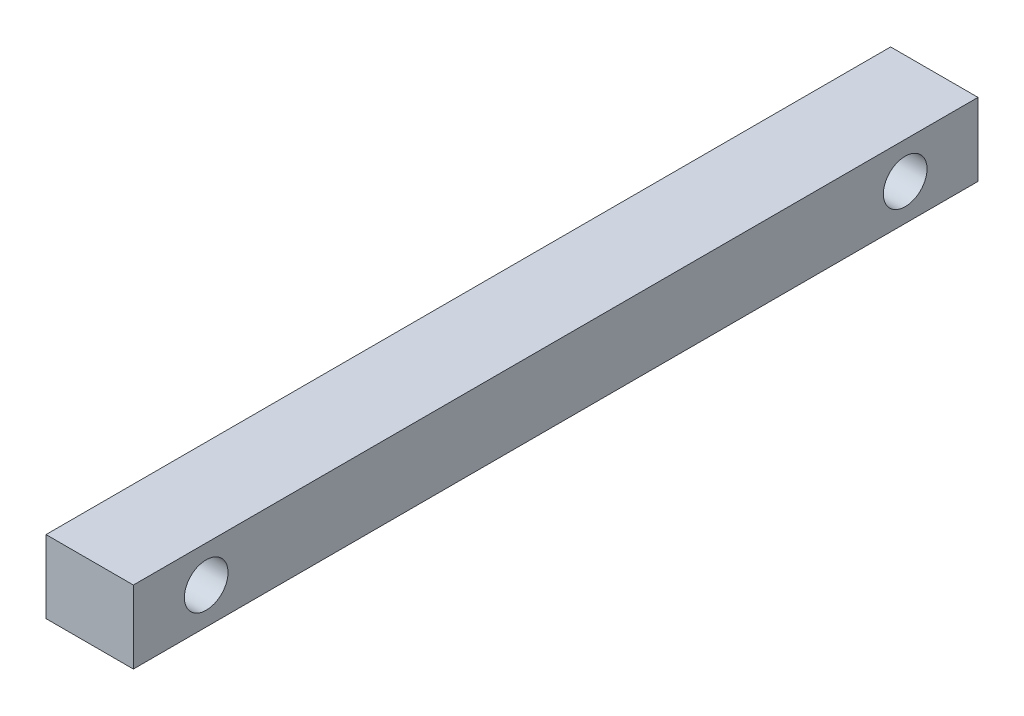
ISO-10303-21;
HEADER;
FILE_DESCRIPTION(('STEP AP214'),'2;1');
FILE_NAME('part.step','',(''),(''),'','','');
FILE_SCHEMA(('AUTOMOTIVE_DESIGN { 1 0 10303 214 1 1 1 1 }'));
ENDSEC;
DATA;
#1=APPLICATION_CONTEXT('core data for automotive mechanical design processes');
#2=APPLICATION_PROTOCOL_DEFINITION('international standard','automotive_design',2000,#1);
#3=PRODUCT_CONTEXT('',#1,'mechanical');
#4=PRODUCT('Part','Part','',(#3));
#5=PRODUCT_RELATED_PRODUCT_CATEGORY('part','',(#4));
#6=PRODUCT_DEFINITION_FORMATION('','',#4);
#7=PRODUCT_DEFINITION_CONTEXT('part definition',#1,'design');
#8=PRODUCT_DEFINITION('design','',#6,#7);
#9=PRODUCT_DEFINITION_SHAPE('','',#8);
#10=(LENGTH_UNIT() NAMED_UNIT(*) SI_UNIT(.MILLI.,.METRE.));
#11=(NAMED_UNIT(*) PLANE_ANGLE_UNIT() SI_UNIT($,.RADIAN.));
#12=(NAMED_UNIT(*) SI_UNIT($,.STERADIAN.) SOLID_ANGLE_UNIT());
#13=UNCERTAINTY_MEASURE_WITH_UNIT(LENGTH_MEASURE(1.E-05),#10,'distance_accuracy_value','');
#14=(GEOMETRIC_REPRESENTATION_CONTEXT(3) GLOBAL_UNCERTAINTY_ASSIGNED_CONTEXT((#13)) GLOBAL_UNIT_ASSIGNED_CONTEXT((#10,
#11,#12)) REPRESENTATION_CONTEXT('',''));
#15=CARTESIAN_POINT('',(0.,0.,0.));
#16=DIRECTION('',(0.,0.,1.));
#17=DIRECTION('',(1.,0.,0.));
#18=AXIS2_PLACEMENT_3D('',#15,#16,#17);
#19=CARTESIAN_POINT('',(-15.,-12.5,290.));
#20=DIRECTION('',(1.,0.,0.));
#21=DIRECTION('',(0.,0.,-1.));
#22=AXIS2_PLACEMENT_3D('',#19,#20,#21);
#23=PLANE('',#22);
#24=CARTESIAN_POINT('',(-15.,0.,265.));
#25=DIRECTION('',(-1.,0.,0.));
#26=DIRECTION('',(0.,0.,1.));
#27=AXIS2_PLACEMENT_3D('',#24,#25,#26);
#28=CIRCLE('',#27,7.50000000000001);
#29=CARTESIAN_POINT('',(-15.,0.,272.5));
#30=VERTEX_POINT('',#29);
#31=EDGE_CURVE('E128',#30,#30,#28,.T.);
#32=ORIENTED_EDGE('',*,*,#31,.F.);
#33=EDGE_LOOP('',(#32));
#34=FACE_BOUND('',#33,.T.);
#35=CARTESIAN_POINT('',(-15.,0.,25.));
#36=DIRECTION('',(-1.,0.,0.));
#37=DIRECTION('',(0.,0.,1.));
#38=AXIS2_PLACEMENT_3D('',#35,#36,#37);
#39=CIRCLE('',#38,7.5);
#40=CARTESIAN_POINT('',(-15.,0.,32.5));
#41=VERTEX_POINT('',#40);
#42=EDGE_CURVE('E135',#41,#41,#39,.T.);
#43=ORIENTED_EDGE('',*,*,#42,.F.);
#44=EDGE_LOOP('',(#43));
#45=FACE_BOUND('',#44,.T.);
#46=DIRECTION('',(0.,-1.,0.));
#47=VECTOR('',#46,1.);
#48=CARTESIAN_POINT('',(-15.,-12.5,0.));
#49=LINE('',#48,#47);
#50=CARTESIAN_POINT('',(-15.,12.5,0.));
#51=VERTEX_POINT('',#50);
#52=CARTESIAN_POINT('',(-15.,-12.5,0.));
#53=VERTEX_POINT('',#52);
#54=EDGE_CURVE('E112',#51,#53,#49,.T.);
#55=ORIENTED_EDGE('',*,*,#54,.T.);
#56=DIRECTION('',(0.,0.,-1.));
#57=VECTOR('',#56,1.);
#58=CARTESIAN_POINT('',(-15.,-12.5,290.));
#59=LINE('',#58,#57);
#60=CARTESIAN_POINT('',(-15.,-12.5,290.));
#61=VERTEX_POINT('',#60);
#62=EDGE_CURVE('E11',#61,#53,#59,.T.);
#63=ORIENTED_EDGE('',*,*,#62,.F.);
#64=DIRECTION('',(0.,-1.,0.));
#65=VECTOR('',#64,1.);
#66=CARTESIAN_POINT('',(-15.,-12.5,290.));
#67=LINE('',#66,#65);
#68=CARTESIAN_POINT('',(-15.,12.5,290.));
#69=VERTEX_POINT('',#68);
#70=EDGE_CURVE('E95',#69,#61,#67,.T.);
#71=ORIENTED_EDGE('',*,*,#70,.F.);
#72=DIRECTION('',(0.,0.,-1.));
#73=VECTOR('',#72,1.);
#74=CARTESIAN_POINT('',(-15.,12.5,290.));
#75=LINE('',#74,#73);
#76=EDGE_CURVE('E108',#69,#51,#75,.T.);
#77=ORIENTED_EDGE('',*,*,#76,.T.);
#78=EDGE_LOOP('',(#55,#63,#71,#77));
#79=FACE_BOUND('',#78,.T.);
#80=ADVANCED_FACE('F41',(#34,#45,#79),#23,.F.);
#81=CARTESIAN_POINT('',(15.,-12.5,290.));
#82=DIRECTION('',(0.,1.,0.));
#83=DIRECTION('',(-1.,0.,0.));
#84=AXIS2_PLACEMENT_3D('',#81,#82,#83);
#85=PLANE('',#84);
#86=DIRECTION('',(1.,0.,0.));
#87=VECTOR('',#86,1.);
#88=CARTESIAN_POINT('',(15.,-12.5,0.));
#89=LINE('',#88,#87);
#90=CARTESIAN_POINT('',(15.,-12.5,0.));
#91=VERTEX_POINT('',#90);
#92=EDGE_CURVE('E100',#53,#91,#89,.T.);
#93=ORIENTED_EDGE('',*,*,#92,.T.);
#94=DIRECTION('',(0.,0.,-1.));
#95=VECTOR('',#94,1.);
#96=CARTESIAN_POINT('',(15.,-12.5,290.));
#97=LINE('',#96,#95);
#98=CARTESIAN_POINT('',(15.,-12.5,290.));
#99=VERTEX_POINT('',#98);
#100=EDGE_CURVE('E51',#99,#91,#97,.T.);
#101=ORIENTED_EDGE('',*,*,#100,.F.);
#102=DIRECTION('',(1.,0.,0.));
#103=VECTOR('',#102,1.);
#104=CARTESIAN_POINT('',(15.,-12.5,290.));
#105=LINE('',#104,#103);
#106=EDGE_CURVE('E90',#61,#99,#105,.T.);
#107=ORIENTED_EDGE('',*,*,#106,.F.);
#108=ORIENTED_EDGE('',*,*,#62,.T.);
#109=EDGE_LOOP('',(#93,#101,#107,#108));
#110=FACE_BOUND('',#109,.T.);
#111=ADVANCED_FACE('F99',(#110),#85,.F.);
#112=CARTESIAN_POINT('',(15.,-12.5,290.));
#113=DIRECTION('',(-1.,0.,0.));
#114=DIRECTION('',(0.,0.,1.));
#115=AXIS2_PLACEMENT_3D('',#112,#113,#114);
#116=PLANE('',#115);
#117=CARTESIAN_POINT('',(15.,0.,265.));
#118=DIRECTION('',(-1.,0.,0.));
#119=DIRECTION('',(0.,0.,1.));
#120=AXIS2_PLACEMENT_3D('',#117,#118,#119);
#121=CIRCLE('',#120,7.50000000000001);
#122=CARTESIAN_POINT('',(15.,0.,272.5));
#123=VERTEX_POINT('',#122);
#124=EDGE_CURVE('E44',#123,#123,#121,.T.);
#125=ORIENTED_EDGE('',*,*,#124,.T.);
#126=EDGE_LOOP('',(#125));
#127=FACE_BOUND('',#126,.T.);
#128=CARTESIAN_POINT('',(15.,0.,25.));
#129=DIRECTION('',(-1.,0.,0.));
#130=DIRECTION('',(0.,0.,1.));
#131=AXIS2_PLACEMENT_3D('',#128,#129,#130);
#132=CIRCLE('',#131,7.5);
#133=CARTESIAN_POINT('',(15.,0.,32.5));
#134=VERTEX_POINT('',#133);
#135=EDGE_CURVE('E125',#134,#134,#132,.T.);
#136=ORIENTED_EDGE('',*,*,#135,.T.);
#137=EDGE_LOOP('',(#136));
#138=FACE_BOUND('',#137,.T.);
#139=DIRECTION('',(0.,1.,0.));
#140=VECTOR('',#139,1.);
#141=CARTESIAN_POINT('',(15.,-12.5,0.));
#142=LINE('',#141,#140);
#143=CARTESIAN_POINT('',(15.,12.5,0.));
#144=VERTEX_POINT('',#143);
#145=EDGE_CURVE('E77',#91,#144,#142,.T.);
#146=ORIENTED_EDGE('',*,*,#145,.T.);
#147=DIRECTION('',(0.,0.,-1.));
#148=VECTOR('',#147,1.);
#149=CARTESIAN_POINT('',(15.,12.5,290.));
#150=LINE('',#149,#148);
#151=CARTESIAN_POINT('',(15.,12.5,290.));
#152=VERTEX_POINT('',#151);
#153=EDGE_CURVE('E102',#152,#144,#150,.T.);
#154=ORIENTED_EDGE('',*,*,#153,.F.);
#155=DIRECTION('',(0.,1.,0.));
#156=VECTOR('',#155,1.);
#157=CARTESIAN_POINT('',(15.,-12.5,290.));
#158=LINE('',#157,#156);
#159=EDGE_CURVE('E93',#99,#152,#158,.T.);
#160=ORIENTED_EDGE('',*,*,#159,.F.);
#161=ORIENTED_EDGE('',*,*,#100,.T.);
#162=EDGE_LOOP('',(#146,#154,#160,#161));
#163=FACE_BOUND('',#162,.T.);
#164=ADVANCED_FACE('F104',(#127,#138,#163),#116,.F.);
#165=CARTESIAN_POINT('',(15.,12.5,290.));
#166=DIRECTION('',(0.,-1.,0.));
#167=DIRECTION('',(1.,0.,0.));
#168=AXIS2_PLACEMENT_3D('',#165,#166,#167);
#169=PLANE('',#168);
#170=DIRECTION('',(-1.,0.,0.));
#171=VECTOR('',#170,1.);
#172=CARTESIAN_POINT('',(15.,12.5,0.));
#173=LINE('',#172,#171);
#174=EDGE_CURVE('E83',#144,#51,#173,.T.);
#175=ORIENTED_EDGE('',*,*,#174,.T.);
#176=ORIENTED_EDGE('',*,*,#76,.F.);
#177=DIRECTION('',(-1.,0.,0.));
#178=VECTOR('',#177,1.);
#179=CARTESIAN_POINT('',(15.,12.5,290.));
#180=LINE('',#179,#178);
#181=EDGE_CURVE('E60',#152,#69,#180,.T.);
#182=ORIENTED_EDGE('',*,*,#181,.F.);
#183=ORIENTED_EDGE('',*,*,#153,.T.);
#184=EDGE_LOOP('',(#175,#176,#182,#183));
#185=FACE_BOUND('',#184,.T.);
#186=ADVANCED_FACE('F162',(#185),#169,.F.);
#187=CARTESIAN_POINT('',(0.,0.,290.));
#188=DIRECTION('',(0.,0.,1.));
#189=DIRECTION('',(1.,0.,0.));
#190=AXIS2_PLACEMENT_3D('',#187,#188,#189);
#191=PLANE('',#190);
#192=ORIENTED_EDGE('',*,*,#70,.T.);
#193=ORIENTED_EDGE('',*,*,#106,.T.);
#194=ORIENTED_EDGE('',*,*,#159,.T.);
#195=ORIENTED_EDGE('',*,*,#181,.T.);
#196=EDGE_LOOP('',(#192,#193,#194,#195));
#197=FACE_BOUND('',#196,.T.);
#198=ADVANCED_FACE('F91',(#197),#191,.T.);
#199=CARTESIAN_POINT('',(0.,0.,0.));
#200=DIRECTION('',(0.,0.,1.));
#201=DIRECTION('',(1.,0.,0.));
#202=AXIS2_PLACEMENT_3D('',#199,#200,#201);
#203=PLANE('',#202);
#204=ORIENTED_EDGE('',*,*,#54,.F.);
#205=ORIENTED_EDGE('',*,*,#174,.F.);
#206=ORIENTED_EDGE('',*,*,#145,.F.);
#207=ORIENTED_EDGE('',*,*,#92,.F.);
#208=EDGE_LOOP('',(#204,#205,#206,#207));
#209=FACE_BOUND('',#208,.T.);
#210=ADVANCED_FACE('F153',(#209),#203,.F.);
#211=CARTESIAN_POINT('',(275.,0.,25.));
#212=DIRECTION('',(-1.,0.,0.));
#213=DIRECTION('',(0.,0.,1.));
#214=AXIS2_PLACEMENT_3D('',#211,#212,#213);
#215=CYLINDRICAL_SURFACE('',#214,7.5);
#216=ORIENTED_EDGE('',*,*,#42,.T.);
#217=EDGE_LOOP('',(#216));
#218=FACE_BOUND('',#217,.T.);
#219=ORIENTED_EDGE('',*,*,#135,.F.);
#220=EDGE_LOOP('',(#219));
#221=FACE_BOUND('',#220,.T.);
#222=ADVANCED_FACE('F145',(#218,#221),#215,.F.);
#223=CARTESIAN_POINT('',(275.,0.,265.));
#224=DIRECTION('',(-1.,0.,0.));
#225=DIRECTION('',(0.,0.,1.));
#226=AXIS2_PLACEMENT_3D('',#223,#224,#225);
#227=CYLINDRICAL_SURFACE('',#226,7.50000000000001);
#228=ORIENTED_EDGE('',*,*,#31,.T.);
#229=EDGE_LOOP('',(#228));
#230=FACE_BOUND('',#229,.T.);
#231=ORIENTED_EDGE('',*,*,#124,.F.);
#232=EDGE_LOOP('',(#231));
#233=FACE_BOUND('',#232,.T.);
#234=ADVANCED_FACE('F160',(#230,#233),#227,.F.);
#235=CLOSED_SHELL('',(#80,#111,#164,#186,#198,#210,#222,#234));
#236=MANIFOLD_SOLID_BREP('B2',#235);
#237=ADVANCED_BREP_SHAPE_REPRESENTATION('',(#18,#236),#14);
#238=SHAPE_DEFINITION_REPRESENTATION(#9,#237);
ENDSEC;
END-ISO-10303-21;
